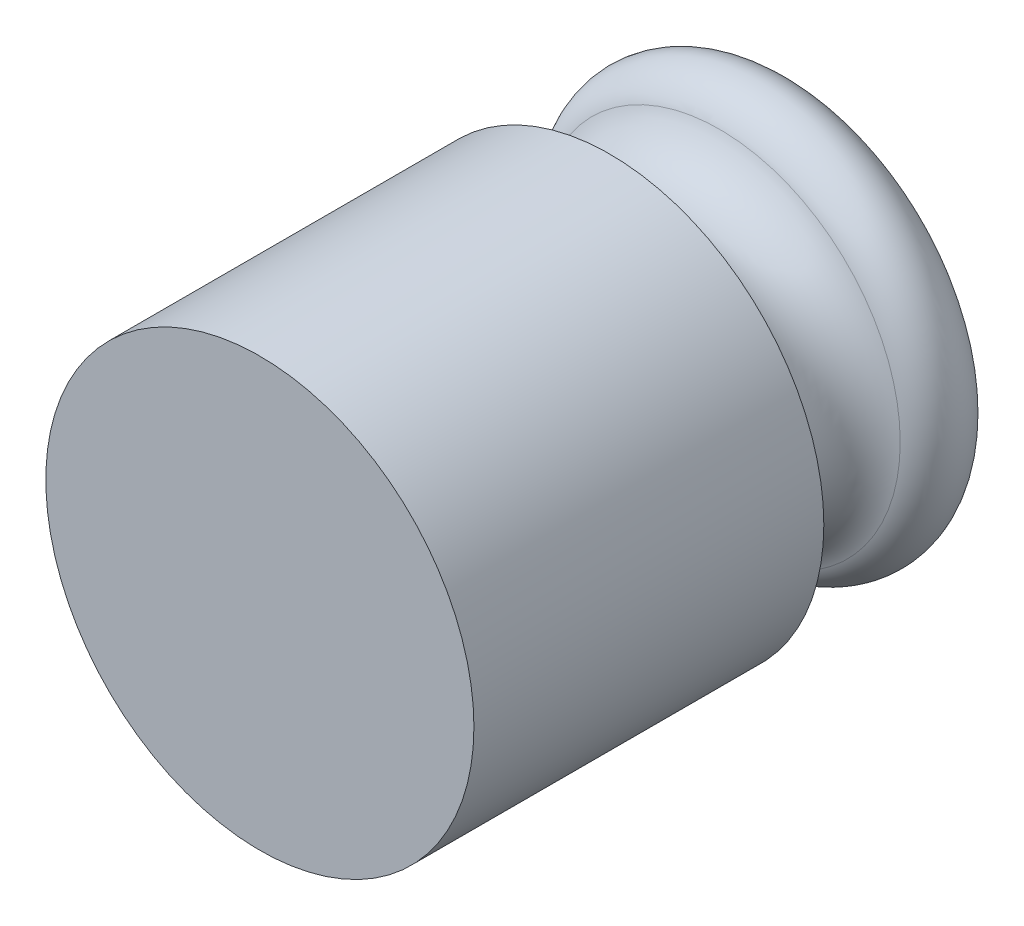
ISO-10303-21;
HEADER;
FILE_DESCRIPTION(('STEP AP214'),'2;1');
FILE_NAME('part.step','',(''),(''),'','','');
FILE_SCHEMA(('AUTOMOTIVE_DESIGN { 1 0 10303 214 1 1 1 1 }'));
ENDSEC;
DATA;
#1=APPLICATION_CONTEXT('core data for automotive mechanical design processes');
#2=APPLICATION_PROTOCOL_DEFINITION('international standard','automotive_design',2000,#1);
#3=PRODUCT_CONTEXT('',#1,'mechanical');
#4=PRODUCT('Part','Part','',(#3));
#5=PRODUCT_RELATED_PRODUCT_CATEGORY('part','',(#4));
#6=PRODUCT_DEFINITION_FORMATION('','',#4);
#7=PRODUCT_DEFINITION_CONTEXT('part definition',#1,'design');
#8=PRODUCT_DEFINITION('design','',#6,#7);
#9=PRODUCT_DEFINITION_SHAPE('','',#8);
#10=(LENGTH_UNIT() NAMED_UNIT(*) SI_UNIT(.MILLI.,.METRE.));
#11=(NAMED_UNIT(*) PLANE_ANGLE_UNIT() SI_UNIT($,.RADIAN.));
#12=(NAMED_UNIT(*) SI_UNIT($,.STERADIAN.) SOLID_ANGLE_UNIT());
#13=UNCERTAINTY_MEASURE_WITH_UNIT(LENGTH_MEASURE(1.E-05),#10,'distance_accuracy_value','');
#14=(GEOMETRIC_REPRESENTATION_CONTEXT(3) GLOBAL_UNCERTAINTY_ASSIGNED_CONTEXT((#13)) GLOBAL_UNIT_ASSIGNED_CONTEXT((#10,
#11,#12)) REPRESENTATION_CONTEXT('',''));
#15=CARTESIAN_POINT('',(0.,0.,0.));
#16=DIRECTION('',(0.,0.,1.));
#17=DIRECTION('',(1.,0.,0.));
#18=AXIS2_PLACEMENT_3D('',#15,#16,#17);
#19=CARTESIAN_POINT('',(0.,0.,12.75));
#20=DIRECTION('',(0.,0.,-1.));
#21=DIRECTION('',(-1.,0.,0.));
#22=AXIS2_PLACEMENT_3D('',#19,#20,#21);
#23=CYLINDRICAL_SURFACE('',#22,15.6);
#24=CARTESIAN_POINT('',(0.,0.,12.75));
#25=DIRECTION('',(0.,0.,1.));
#26=DIRECTION('',(1.,0.,0.));
#27=AXIS2_PLACEMENT_3D('',#24,#25,#26);
#28=CIRCLE('',#27,15.6);
#29=CARTESIAN_POINT('',(15.6,0.,12.75));
#30=VERTEX_POINT('',#29);
#31=EDGE_CURVE('E10',#30,#30,#28,.T.);
#32=ORIENTED_EDGE('',*,*,#31,.F.);
#33=EDGE_LOOP('',(#32));
#34=FACE_BOUND('',#33,.T.);
#35=CARTESIAN_POINT('',(0.,0.,-12.75));
#36=DIRECTION('',(0.,0.,1.));
#37=DIRECTION('',(1.,0.,0.));
#38=AXIS2_PLACEMENT_3D('',#35,#36,#37);
#39=CIRCLE('',#38,15.6);
#40=CARTESIAN_POINT('',(15.6,0.,-12.75));
#41=VERTEX_POINT('',#40);
#42=EDGE_CURVE('E42',#41,#41,#39,.T.);
#43=ORIENTED_EDGE('',*,*,#42,.T.);
#44=EDGE_LOOP('',(#43));
#45=FACE_BOUND('',#44,.T.);
#46=ADVANCED_FACE('F39',(#34,#45),#23,.T.);
#47=CARTESIAN_POINT('',(0.,0.,12.75));
#48=DIRECTION('',(0.,0.,1.));
#49=DIRECTION('',(1.,0.,0.));
#50=AXIS2_PLACEMENT_3D('',#47,#48,#49);
#51=PLANE('',#50);
#52=ORIENTED_EDGE('',*,*,#31,.T.);
#53=EDGE_LOOP('',(#52));
#54=FACE_BOUND('',#53,.T.);
#55=ADVANCED_FACE('F72',(#54),#51,.T.);
#56=CARTESIAN_POINT('',(0.,0.,-12.75));
#57=DIRECTION('',(0.,0.,1.));
#58=DIRECTION('',(1.,0.,0.));
#59=AXIS2_PLACEMENT_3D('',#56,#57,#58);
#60=PLANE('',#59);
#61=CARTESIAN_POINT('',(0.,0.,-12.75));
#62=DIRECTION('',(0.,0.,1.));
#63=DIRECTION('',(1.,0.,0.));
#64=AXIS2_PLACEMENT_3D('',#61,#62,#63);
#65=CIRCLE('',#64,14.6346940192449);
#66=CARTESIAN_POINT('',(14.6346940192449,0.,-12.75));
#67=VERTEX_POINT('',#66);
#68=EDGE_CURVE('E49',#67,#67,#65,.T.);
#69=ORIENTED_EDGE('',*,*,#68,.T.);
#70=EDGE_LOOP('',(#69));
#71=FACE_BOUND('',#70,.T.);
#72=ORIENTED_EDGE('',*,*,#42,.F.);
#73=EDGE_LOOP('',(#72));
#74=FACE_BOUND('',#73,.T.);
#75=ADVANCED_FACE('F77',(#71,#74),#60,.F.);
#76=CARTESIAN_POINT('',(0.,0.,-16.8846940192449));
#77=DIRECTION('',(0.,0.,1.));
#78=DIRECTION('',(1.,0.,0.));
#79=AXIS2_PLACEMENT_3D('',#76,#77,#78);
#80=TOROIDAL_SURFACE('',#79,14.6346940192449,4.13469401924486);
#81=ORIENTED_EDGE('',*,*,#68,.F.);
#82=EDGE_LOOP('',(#81));
#83=FACE_BOUND('',#82,.T.);
#84=CARTESIAN_POINT('',(0.,0.,-20.75));
#85=DIRECTION('',(0.,0.,1.));
#86=DIRECTION('',(1.,0.,0.));
#87=AXIS2_PLACEMENT_3D('',#84,#85,#86);
#88=CIRCLE('',#87,13.1666666666667);
#89=CARTESIAN_POINT('',(13.1666666666667,0.,-20.75));
#90=VERTEX_POINT('',#89);
#91=EDGE_CURVE('E53',#90,#90,#88,.T.);
#92=ORIENTED_EDGE('',*,*,#91,.T.);
#93=EDGE_LOOP('',(#92));
#94=FACE_BOUND('',#93,.T.);
#95=ADVANCED_FACE('F68',(#83,#94),#80,.F.);
#96=CARTESIAN_POINT('',(0.,0.,-23.4073978617692));
#97=DIRECTION('',(0.,0.,1.));
#98=DIRECTION('',(1.,0.,0.));
#99=AXIS2_PLACEMENT_3D('',#96,#97,#98);
#100=TOROIDAL_SURFACE('',#99,12.1573978617692,2.84260213823084);
#101=ORIENTED_EDGE('',*,*,#91,.F.);
#102=EDGE_LOOP('',(#101));
#103=FACE_BOUND('',#102,.T.);
#104=CARTESIAN_POINT('',(0.,0.,-26.25));
#105=DIRECTION('',(0.,0.,1.));
#106=DIRECTION('',(1.,0.,0.));
#107=AXIS2_PLACEMENT_3D('',#104,#105,#106);
#108=CIRCLE('',#107,12.1573978617692);
#109=CARTESIAN_POINT('',(12.1573978617692,0.,-26.25));
#110=VERTEX_POINT('',#109);
#111=EDGE_CURVE('E56',#110,#110,#108,.T.);
#112=ORIENTED_EDGE('',*,*,#111,.T.);
#113=EDGE_LOOP('',(#112));
#114=FACE_BOUND('',#113,.T.);
#115=ADVANCED_FACE('F60',(#103,#114),#100,.T.);
#116=CARTESIAN_POINT('',(0.,12.1573978617692,-26.25));
#117=DIRECTION('',(0.,0.,1.));
#118=DIRECTION('',(1.,0.,0.));
#119=AXIS2_PLACEMENT_3D('',#116,#117,#118);
#120=PLANE('',#119);
#121=ORIENTED_EDGE('',*,*,#111,.F.);
#122=EDGE_LOOP('',(#121));
#123=FACE_BOUND('',#122,.T.);
#124=ADVANCED_FACE('F62',(#123),#120,.F.);
#125=CLOSED_SHELL('',(#46,#55,#75,#95,#115,#124));
#126=MANIFOLD_SOLID_BREP('B2',#125);
#127=ADVANCED_BREP_SHAPE_REPRESENTATION('',(#18,#126),#14);
#128=SHAPE_DEFINITION_REPRESENTATION(#9,#127);
ENDSEC;
END-ISO-10303-21;
